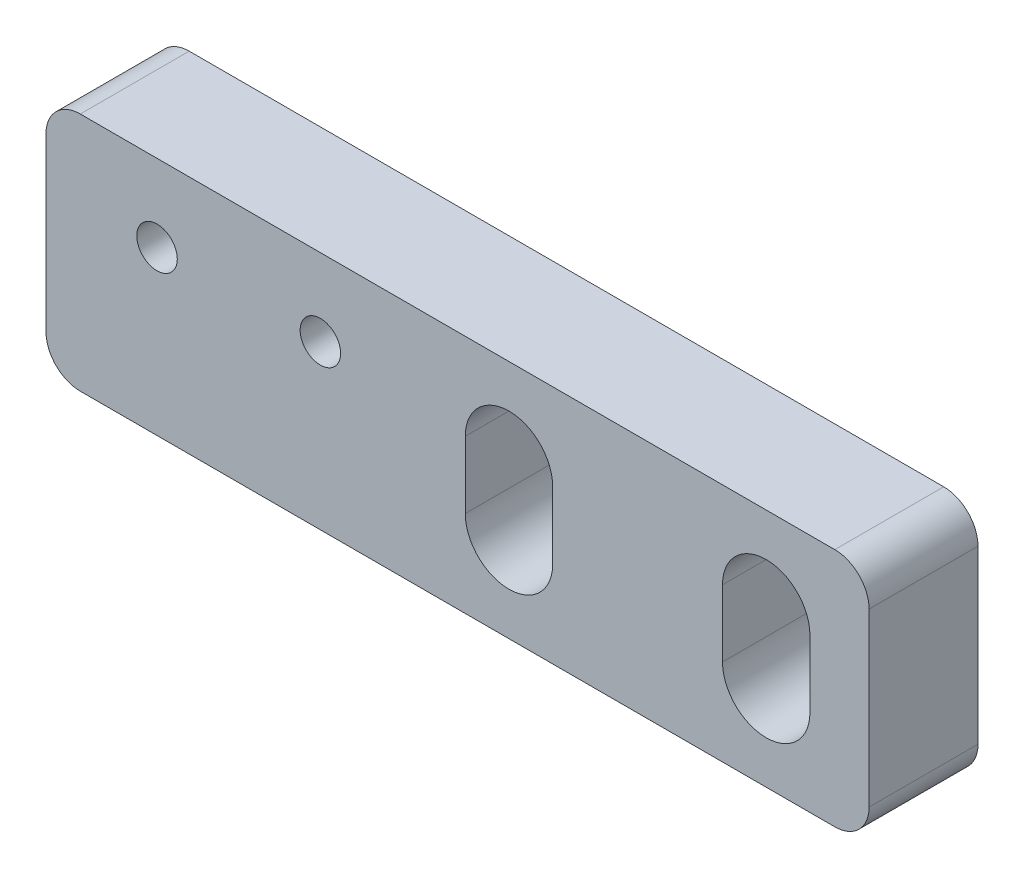
ISO-10303-21;
HEADER;
FILE_DESCRIPTION(('STEP AP214'),'2;1');
FILE_NAME('part.step','',(''),(''),'','','');
FILE_SCHEMA(('AUTOMOTIVE_DESIGN { 1 0 10303 214 1 1 1 1 }'));
ENDSEC;
DATA;
#1=APPLICATION_CONTEXT('core data for automotive mechanical design processes');
#2=APPLICATION_PROTOCOL_DEFINITION('international standard','automotive_design',2000,#1);
#3=PRODUCT_CONTEXT('',#1,'mechanical');
#4=PRODUCT('Part','Part','',(#3));
#5=PRODUCT_RELATED_PRODUCT_CATEGORY('part','',(#4));
#6=PRODUCT_DEFINITION_FORMATION('','',#4);
#7=PRODUCT_DEFINITION_CONTEXT('part definition',#1,'design');
#8=PRODUCT_DEFINITION('design','',#6,#7);
#9=PRODUCT_DEFINITION_SHAPE('','',#8);
#10=(LENGTH_UNIT() NAMED_UNIT(*) SI_UNIT(.MILLI.,.METRE.));
#11=(NAMED_UNIT(*) PLANE_ANGLE_UNIT() SI_UNIT($,.RADIAN.));
#12=(NAMED_UNIT(*) SI_UNIT($,.STERADIAN.) SOLID_ANGLE_UNIT());
#13=UNCERTAINTY_MEASURE_WITH_UNIT(LENGTH_MEASURE(1.E-05),#10,'distance_accuracy_value','');
#14=(GEOMETRIC_REPRESENTATION_CONTEXT(3) GLOBAL_UNCERTAINTY_ASSIGNED_CONTEXT((#13)) GLOBAL_UNIT_ASSIGNED_CONTEXT((#10,
#11,#12)) REPRESENTATION_CONTEXT('',''));
#15=CARTESIAN_POINT('',(0.,0.,0.));
#16=DIRECTION('',(0.,0.,1.));
#17=DIRECTION('',(1.,0.,0.));
#18=AXIS2_PLACEMENT_3D('',#15,#16,#17);
#19=CARTESIAN_POINT('',(421.033701587885,207.351559901808,0.));
#20=DIRECTION('',(0.,0.,1.));
#21=DIRECTION('',(1.,0.,0.));
#22=AXIS2_PLACEMENT_3D('',#19,#20,#21);
#23=PLANE('',#22);
#24=CARTESIAN_POINT('',(403.50870158906,248.88385422266,0.));
#25=DIRECTION('',(0.,0.,1.));
#26=DIRECTION('',(1.,0.,0.));
#27=AXIS2_PLACEMENT_3D('',#24,#25,#26);
#28=CIRCLE('',#27,2.28600000000001);
#29=CARTESIAN_POINT('',(405.79470158906,248.88385422266,0.));
#30=VERTEX_POINT('',#29);
#31=EDGE_CURVE('E356',#30,#30,#28,.T.);
#32=ORIENTED_EDGE('',*,*,#31,.T.);
#33=EDGE_LOOP('',(#32));
#34=FACE_BOUND('',#33,.T.);
#35=CARTESIAN_POINT('',(424.033701588,244.4338542225,0.));
#36=DIRECTION('',(0.,0.,1.));
#37=DIRECTION('',(1.,0.,0.));
#38=AXIS2_PLACEMENT_3D('',#35,#36,#37);
#39=CIRCLE('',#38,2.55000000032002);
#40=CARTESIAN_POINT('',(421.48370158768,244.4338542225,0.));
#41=VERTEX_POINT('',#40);
#42=CARTESIAN_POINT('',(426.58370158832,244.4338542225,0.));
#43=VERTEX_POINT('',#42);
#44=EDGE_CURVE('E188',#41,#43,#39,.T.);
#45=ORIENTED_EDGE('',*,*,#44,.T.);
#46=DIRECTION('',(0.,1.,0.));
#47=VECTOR('',#46,1.);
#48=CARTESIAN_POINT('',(426.58370158832,207.351559901808,0.));
#49=LINE('',#48,#47);
#50=CARTESIAN_POINT('',(426.58370158832,248.33385422284,0.));
#51=VERTEX_POINT('',#50);
#52=EDGE_CURVE('E198',#43,#51,#49,.T.);
#53=ORIENTED_EDGE('',*,*,#52,.T.);
#54=CARTESIAN_POINT('',(424.033701588,248.33385422284,0.));
#55=DIRECTION('',(0.,0.,1.));
#56=DIRECTION('',(1.,0.,0.));
#57=AXIS2_PLACEMENT_3D('',#54,#55,#56);
#58=CIRCLE('',#57,2.55000000032002);
#59=CARTESIAN_POINT('',(421.48370158768,248.33385422284,0.));
#60=VERTEX_POINT('',#59);
#61=EDGE_CURVE('E195',#51,#60,#58,.T.);
#62=ORIENTED_EDGE('',*,*,#61,.T.);
#63=DIRECTION('',(0.,-1.,0.));
#64=VECTOR('',#63,1.);
#65=CARTESIAN_POINT('',(421.48370158768,207.351559901808,0.));
#66=LINE('',#65,#64);
#67=EDGE_CURVE('E191',#60,#41,#66,.T.);
#68=ORIENTED_EDGE('',*,*,#67,.T.);
#69=EDGE_LOOP('',(#45,#53,#62,#68));
#70=FACE_BOUND('',#69,.T.);
#71=CARTESIAN_POINT('',(439.03370158794,244.4338542225,0.));
#72=DIRECTION('',(0.,0.,1.));
#73=DIRECTION('',(1.,0.,0.));
#74=AXIS2_PLACEMENT_3D('',#71,#72,#73);
#75=CIRCLE('',#74,2.55000000032002);
#76=CARTESIAN_POINT('',(436.48370158762,244.4338542225,0.));
#77=VERTEX_POINT('',#76);
#78=CARTESIAN_POINT('',(441.58370158826,244.4338542225,0.));
#79=VERTEX_POINT('',#78);
#80=EDGE_CURVE('E201',#77,#79,#75,.T.);
#81=ORIENTED_EDGE('',*,*,#80,.T.);
#82=DIRECTION('',(0.,1.,0.));
#83=VECTOR('',#82,1.);
#84=CARTESIAN_POINT('',(441.58370158826,207.351559901808,0.));
#85=LINE('',#84,#83);
#86=CARTESIAN_POINT('',(441.58370158826,248.33385422284,0.));
#87=VERTEX_POINT('',#86);
#88=EDGE_CURVE('E210',#79,#87,#85,.T.);
#89=ORIENTED_EDGE('',*,*,#88,.T.);
#90=CARTESIAN_POINT('',(439.03370158794,248.33385422284,0.));
#91=DIRECTION('',(0.,0.,1.));
#92=DIRECTION('',(1.,0.,0.));
#93=AXIS2_PLACEMENT_3D('',#90,#91,#92);
#94=CIRCLE('',#93,2.55000000032002);
#95=CARTESIAN_POINT('',(436.48370158762,248.33385422284,0.));
#96=VERTEX_POINT('',#95);
#97=EDGE_CURVE('E207',#87,#96,#94,.T.);
#98=ORIENTED_EDGE('',*,*,#97,.T.);
#99=DIRECTION('',(0.,-1.,0.));
#100=VECTOR('',#99,1.);
#101=CARTESIAN_POINT('',(436.48370158762,207.351559901808,0.));
#102=LINE('',#101,#100);
#103=EDGE_CURVE('E204',#96,#77,#102,.T.);
#104=ORIENTED_EDGE('',*,*,#103,.T.);
#105=EDGE_LOOP('',(#81,#89,#98,#104));
#106=FACE_BOUND('',#105,.T.);
#107=DIRECTION('',(1.,0.,0.));
#108=VECTOR('',#107,1.);
#109=CARTESIAN_POINT('',(421.033701587885,239.38385422346,0.));
#110=LINE('',#109,#108);
#111=CARTESIAN_POINT('',(399.0337015881,239.38385422346,0.));
#112=VERTEX_POINT('',#111);
#113=CARTESIAN_POINT('',(443.03370158894,239.38385422346,0.));
#114=VERTEX_POINT('',#113);
#115=EDGE_CURVE('E213',#112,#114,#110,.T.);
#116=ORIENTED_EDGE('',*,*,#115,.F.);
#117=CARTESIAN_POINT('',(399.0337015881,241.38385422396,0.));
#118=DIRECTION('',(0.,0.,1.));
#119=DIRECTION('',(1.,0.,0.));
#120=AXIS2_PLACEMENT_3D('',#117,#118,#119);
#121=CIRCLE('',#120,2.00000000049999);
#122=CARTESIAN_POINT('',(397.0337015876,241.38385422396,0.));
#123=VERTEX_POINT('',#122);
#124=EDGE_CURVE('E111',#123,#112,#121,.T.);
#125=ORIENTED_EDGE('',*,*,#124,.F.);
#126=DIRECTION('',(0.,-1.,0.));
#127=VECTOR('',#126,1.);
#128=CARTESIAN_POINT('',(397.0337015876,207.351559901808,0.));
#129=LINE('',#128,#127);
#130=CARTESIAN_POINT('',(397.0337015876,251.38385422392,0.));
#131=VERTEX_POINT('',#130);
#132=EDGE_CURVE('E105',#131,#123,#129,.T.);
#133=ORIENTED_EDGE('',*,*,#132,.F.);
#134=CARTESIAN_POINT('',(399.0337015881,251.38385422392,0.));
#135=DIRECTION('',(0.,0.,1.));
#136=DIRECTION('',(1.,0.,0.));
#137=AXIS2_PLACEMENT_3D('',#134,#135,#136);
#138=CIRCLE('',#137,2.00000000050002);
#139=CARTESIAN_POINT('',(399.0337015881,253.38385422442,0.));
#140=VERTEX_POINT('',#139);
#141=EDGE_CURVE('E172',#140,#131,#138,.T.);
#142=ORIENTED_EDGE('',*,*,#141,.F.);
#143=DIRECTION('',(-1.,0.,0.));
#144=VECTOR('',#143,1.);
#145=CARTESIAN_POINT('',(421.033701587885,253.38385422442,0.));
#146=LINE('',#145,#144);
#147=CARTESIAN_POINT('',(443.03370158894,253.38385422442,0.));
#148=VERTEX_POINT('',#147);
#149=EDGE_CURVE('E222',#148,#140,#146,.T.);
#150=ORIENTED_EDGE('',*,*,#149,.F.);
#151=CARTESIAN_POINT('',(443.03370158894,251.38385422519,0.));
#152=DIRECTION('',(0.,0.,1.));
#153=DIRECTION('',(1.,0.,0.));
#154=AXIS2_PLACEMENT_3D('',#151,#152,#153);
#155=CIRCLE('',#154,1.99999999923003);
#156=CARTESIAN_POINT('',(445.03370158817,251.38385422265,0.));
#157=VERTEX_POINT('',#156);
#158=EDGE_CURVE('E220',#157,#148,#155,.T.);
#159=ORIENTED_EDGE('',*,*,#158,.F.);
#160=DIRECTION('',(0.,1.,0.));
#161=VECTOR('',#160,1.);
#162=CARTESIAN_POINT('',(445.03370158817,207.351559901808,0.));
#163=LINE('',#162,#161);
#164=CARTESIAN_POINT('',(445.03370158817,241.38385422269,0.));
#165=VERTEX_POINT('',#164);
#166=EDGE_CURVE('E218',#165,#157,#163,.T.);
#167=ORIENTED_EDGE('',*,*,#166,.F.);
#168=CARTESIAN_POINT('',(443.03370158894,241.38385422269,0.));
#169=DIRECTION('',(0.,0.,1.));
#170=DIRECTION('',(1.,0.,0.));
#171=AXIS2_PLACEMENT_3D('',#168,#169,#170);
#172=CIRCLE('',#171,1.99999999923001);
#173=EDGE_CURVE('E216',#114,#165,#172,.T.);
#174=ORIENTED_EDGE('',*,*,#173,.F.);
#175=EDGE_LOOP('',(#116,#125,#133,#142,#150,#159,#167,#174));
#176=FACE_BOUND('',#175,.T.);
#177=CARTESIAN_POINT('',(413.03370158906,248.88385422266,0.));
#178=DIRECTION('',(0.,0.,1.));
#179=DIRECTION('',(1.,0.,0.));
#180=AXIS2_PLACEMENT_3D('',#177,#178,#179);
#181=CIRCLE('',#180,2.28600000000001);
#182=CARTESIAN_POINT('',(415.31970158906,248.88385422266,0.));
#183=VERTEX_POINT('',#182);
#184=EDGE_CURVE('E363',#183,#183,#181,.T.);
#185=ORIENTED_EDGE('',*,*,#184,.T.);
#186=EDGE_LOOP('',(#185));
#187=FACE_BOUND('',#186,.T.);
#188=ADVANCED_FACE('F33',(#34,#70,#106,#176,#187),#23,.F.);
#189=CARTESIAN_POINT('',(421.033701587885,239.38385422346,6.35));
#190=DIRECTION('',(0.,1.,0.));
#191=DIRECTION('',(0.,0.,1.));
#192=AXIS2_PLACEMENT_3D('',#189,#190,#191);
#193=PLANE('',#192);
#194=ORIENTED_EDGE('',*,*,#115,.T.);
#195=DIRECTION('',(0.,0.,-1.));
#196=VECTOR('',#195,1.);
#197=CARTESIAN_POINT('',(443.03370158894,239.38385422346,6.35));
#198=LINE('',#197,#196);
#199=CARTESIAN_POINT('',(443.03370158894,239.38385422346,6.35));
#200=VERTEX_POINT('',#199);
#201=EDGE_CURVE('E11',#200,#114,#198,.T.);
#202=ORIENTED_EDGE('',*,*,#201,.F.);
#203=DIRECTION('',(1.,0.,0.));
#204=VECTOR('',#203,1.);
#205=CARTESIAN_POINT('',(421.033701587885,239.38385422346,6.35));
#206=LINE('',#205,#204);
#207=CARTESIAN_POINT('',(399.0337015881,239.38385422346,6.35));
#208=VERTEX_POINT('',#207);
#209=EDGE_CURVE('E289',#208,#200,#206,.T.);
#210=ORIENTED_EDGE('',*,*,#209,.F.);
#211=DIRECTION('',(0.,0.,-1.));
#212=VECTOR('',#211,1.);
#213=CARTESIAN_POINT('',(399.0337015881,239.38385422346,6.35));
#214=LINE('',#213,#212);
#215=EDGE_CURVE('E228',#208,#112,#214,.T.);
#216=ORIENTED_EDGE('',*,*,#215,.T.);
#217=EDGE_LOOP('',(#194,#202,#210,#216));
#218=FACE_BOUND('',#217,.T.);
#219=ADVANCED_FACE('F312',(#218),#193,.F.);
#220=CARTESIAN_POINT('',(443.03370158894,241.38385422269,6.35));
#221=DIRECTION('',(0.,0.,-1.));
#222=DIRECTION('',(-1.,0.,0.));
#223=AXIS2_PLACEMENT_3D('',#220,#221,#222);
#224=CYLINDRICAL_SURFACE('',#223,1.99999999923001);
#225=ORIENTED_EDGE('',*,*,#173,.T.);
#226=DIRECTION('',(0.,0.,-1.));
#227=VECTOR('',#226,1.);
#228=CARTESIAN_POINT('',(445.03370158817,241.38385422269,6.35));
#229=LINE('',#228,#227);
#230=CARTESIAN_POINT('',(445.03370158817,241.38385422269,6.35));
#231=VERTEX_POINT('',#230);
#232=EDGE_CURVE('E43',#231,#165,#229,.T.);
#233=ORIENTED_EDGE('',*,*,#232,.F.);
#234=CARTESIAN_POINT('',(443.03370158894,241.38385422269,6.35));
#235=DIRECTION('',(0.,0.,1.));
#236=DIRECTION('',(1.,0.,0.));
#237=AXIS2_PLACEMENT_3D('',#234,#235,#236);
#238=CIRCLE('',#237,1.99999999923001);
#239=EDGE_CURVE('E291',#200,#231,#238,.T.);
#240=ORIENTED_EDGE('',*,*,#239,.F.);
#241=ORIENTED_EDGE('',*,*,#201,.T.);
#242=EDGE_LOOP('',(#225,#233,#240,#241));
#243=FACE_BOUND('',#242,.T.);
#244=ADVANCED_FACE('F334',(#243),#224,.T.);
#245=CARTESIAN_POINT('',(445.03370158817,207.351559901808,6.35));
#246=DIRECTION('',(-1.,0.,0.));
#247=DIRECTION('',(0.,0.,1.));
#248=AXIS2_PLACEMENT_3D('',#245,#246,#247);
#249=PLANE('',#248);
#250=ORIENTED_EDGE('',*,*,#166,.T.);
#251=DIRECTION('',(0.,0.,-1.));
#252=VECTOR('',#251,1.);
#253=CARTESIAN_POINT('',(445.03370158817,251.38385422265,6.35));
#254=LINE('',#253,#252);
#255=CARTESIAN_POINT('',(445.03370158817,251.38385422265,6.35));
#256=VERTEX_POINT('',#255);
#257=EDGE_CURVE('E236',#256,#157,#254,.T.);
#258=ORIENTED_EDGE('',*,*,#257,.F.);
#259=DIRECTION('',(0.,1.,0.));
#260=VECTOR('',#259,1.);
#261=CARTESIAN_POINT('',(445.03370158817,207.351559901808,6.35));
#262=LINE('',#261,#260);
#263=EDGE_CURVE('E293',#231,#256,#262,.T.);
#264=ORIENTED_EDGE('',*,*,#263,.F.);
#265=ORIENTED_EDGE('',*,*,#232,.T.);
#266=EDGE_LOOP('',(#250,#258,#264,#265));
#267=FACE_BOUND('',#266,.T.);
#268=ADVANCED_FACE('F545',(#267),#249,.F.);
#269=CARTESIAN_POINT('',(443.03370158894,251.38385422519,6.35));
#270=DIRECTION('',(0.,0.,-1.));
#271=DIRECTION('',(-1.,0.,0.));
#272=AXIS2_PLACEMENT_3D('',#269,#270,#271);
#273=CYLINDRICAL_SURFACE('',#272,1.99999999923003);
#274=ORIENTED_EDGE('',*,*,#158,.T.);
#275=DIRECTION('',(0.,0.,-1.));
#276=VECTOR('',#275,1.);
#277=CARTESIAN_POINT('',(443.03370158894,253.38385422442,6.35));
#278=LINE('',#277,#276);
#279=CARTESIAN_POINT('',(443.03370158894,253.38385422442,6.35));
#280=VERTEX_POINT('',#279);
#281=EDGE_CURVE('E233',#280,#148,#278,.T.);
#282=ORIENTED_EDGE('',*,*,#281,.F.);
#283=CARTESIAN_POINT('',(443.03370158894,251.38385422519,6.35));
#284=DIRECTION('',(0.,0.,1.));
#285=DIRECTION('',(1.,0.,0.));
#286=AXIS2_PLACEMENT_3D('',#283,#284,#285);
#287=CIRCLE('',#286,1.99999999923003);
#288=EDGE_CURVE('E295',#256,#280,#287,.T.);
#289=ORIENTED_EDGE('',*,*,#288,.F.);
#290=ORIENTED_EDGE('',*,*,#257,.T.);
#291=EDGE_LOOP('',(#274,#282,#289,#290));
#292=FACE_BOUND('',#291,.T.);
#293=ADVANCED_FACE('F301',(#292),#273,.T.);
#294=CARTESIAN_POINT('',(421.033701587885,253.38385422442,6.35));
#295=DIRECTION('',(0.,-1.,0.));
#296=DIRECTION('',(0.,0.,-1.));
#297=AXIS2_PLACEMENT_3D('',#294,#295,#296);
#298=PLANE('',#297);
#299=ORIENTED_EDGE('',*,*,#149,.T.);
#300=DIRECTION('',(0.,0.,-1.));
#301=VECTOR('',#300,1.);
#302=CARTESIAN_POINT('',(399.0337015881,253.38385422442,6.35));
#303=LINE('',#302,#301);
#304=CARTESIAN_POINT('',(399.0337015881,253.38385422442,6.35));
#305=VERTEX_POINT('',#304);
#306=EDGE_CURVE('E173',#305,#140,#303,.T.);
#307=ORIENTED_EDGE('',*,*,#306,.F.);
#308=DIRECTION('',(-1.,0.,0.));
#309=VECTOR('',#308,1.);
#310=CARTESIAN_POINT('',(421.033701587885,253.38385422442,6.35));
#311=LINE('',#310,#309);
#312=EDGE_CURVE('E164',#280,#305,#311,.T.);
#313=ORIENTED_EDGE('',*,*,#312,.F.);
#314=ORIENTED_EDGE('',*,*,#281,.T.);
#315=EDGE_LOOP('',(#299,#307,#313,#314));
#316=FACE_BOUND('',#315,.T.);
#317=ADVANCED_FACE('F305',(#316),#298,.F.);
#318=CARTESIAN_POINT('',(399.0337015881,251.38385422392,6.35));
#319=DIRECTION('',(0.,0.,-1.));
#320=DIRECTION('',(-1.,0.,0.));
#321=AXIS2_PLACEMENT_3D('',#318,#319,#320);
#322=CYLINDRICAL_SURFACE('',#321,2.00000000050002);
#323=ORIENTED_EDGE('',*,*,#141,.T.);
#324=DIRECTION('',(0.,0.,-1.));
#325=VECTOR('',#324,1.);
#326=CARTESIAN_POINT('',(397.0337015876,251.38385422392,6.35));
#327=LINE('',#326,#325);
#328=CARTESIAN_POINT('',(397.0337015876,251.38385422392,6.35));
#329=VERTEX_POINT('',#328);
#330=EDGE_CURVE('E169',#329,#131,#327,.T.);
#331=ORIENTED_EDGE('',*,*,#330,.F.);
#332=CARTESIAN_POINT('',(399.0337015881,251.38385422392,6.35));
#333=DIRECTION('',(0.,0.,1.));
#334=DIRECTION('',(1.,0.,0.));
#335=AXIS2_PLACEMENT_3D('',#332,#333,#334);
#336=CIRCLE('',#335,2.00000000050002);
#337=EDGE_CURVE('E157',#305,#329,#336,.T.);
#338=ORIENTED_EDGE('',*,*,#337,.F.);
#339=ORIENTED_EDGE('',*,*,#306,.T.);
#340=EDGE_LOOP('',(#323,#331,#338,#339));
#341=FACE_BOUND('',#340,.T.);
#342=ADVANCED_FACE('F170',(#341),#322,.T.);
#343=CARTESIAN_POINT('',(397.0337015876,207.351559901808,6.35));
#344=DIRECTION('',(1.,0.,0.));
#345=DIRECTION('',(0.,0.,-1.));
#346=AXIS2_PLACEMENT_3D('',#343,#344,#345);
#347=PLANE('',#346);
#348=ORIENTED_EDGE('',*,*,#132,.T.);
#349=DIRECTION('',(0.,0.,-1.));
#350=VECTOR('',#349,1.);
#351=CARTESIAN_POINT('',(397.0337015876,241.38385422396,6.35));
#352=LINE('',#351,#350);
#353=CARTESIAN_POINT('',(397.0337015876,241.38385422396,6.35));
#354=VERTEX_POINT('',#353);
#355=EDGE_CURVE('E174',#354,#123,#352,.T.);
#356=ORIENTED_EDGE('',*,*,#355,.F.);
#357=DIRECTION('',(0.,-1.,0.));
#358=VECTOR('',#357,1.);
#359=CARTESIAN_POINT('',(397.0337015876,207.351559901808,6.35));
#360=LINE('',#359,#358);
#361=EDGE_CURVE('E162',#329,#354,#360,.T.);
#362=ORIENTED_EDGE('',*,*,#361,.F.);
#363=ORIENTED_EDGE('',*,*,#330,.T.);
#364=EDGE_LOOP('',(#348,#356,#362,#363));
#365=FACE_BOUND('',#364,.T.);
#366=ADVANCED_FACE('F176',(#365),#347,.F.);
#367=CARTESIAN_POINT('',(439.03370158794,244.4338542225,6.35));
#368=DIRECTION('',(0.,0.,-1.));
#369=DIRECTION('',(-1.,0.,0.));
#370=AXIS2_PLACEMENT_3D('',#367,#368,#369);
#371=CYLINDRICAL_SURFACE('',#370,2.55000000032002);
#372=ORIENTED_EDGE('',*,*,#80,.F.);
#373=DIRECTION('',(0.,0.,-1.));
#374=VECTOR('',#373,1.);
#375=CARTESIAN_POINT('',(436.48370158762,244.4338542225,6.35));
#376=LINE('',#375,#374);
#377=CARTESIAN_POINT('',(436.48370158762,244.4338542225,6.35));
#378=VERTEX_POINT('',#377);
#379=EDGE_CURVE('E230',#378,#77,#376,.T.);
#380=ORIENTED_EDGE('',*,*,#379,.F.);
#381=CARTESIAN_POINT('',(439.03370158794,244.4338542225,6.35));
#382=DIRECTION('',(0.,0.,1.));
#383=DIRECTION('',(1.,0.,0.));
#384=AXIS2_PLACEMENT_3D('',#381,#382,#383);
#385=CIRCLE('',#384,2.55000000032002);
#386=CARTESIAN_POINT('',(441.58370158826,244.4338542225,6.35));
#387=VERTEX_POINT('',#386);
#388=EDGE_CURVE('E274',#378,#387,#385,.T.);
#389=ORIENTED_EDGE('',*,*,#388,.T.);
#390=DIRECTION('',(0.,0.,-1.));
#391=VECTOR('',#390,1.);
#392=CARTESIAN_POINT('',(441.58370158826,244.4338542225,6.35));
#393=LINE('',#392,#391);
#394=EDGE_CURVE('E241',#387,#79,#393,.T.);
#395=ORIENTED_EDGE('',*,*,#394,.T.);
#396=EDGE_LOOP('',(#372,#380,#389,#395));
#397=FACE_BOUND('',#396,.T.);
#398=ADVANCED_FACE('F503',(#397),#371,.F.);
#399=CARTESIAN_POINT('',(436.48370158762,207.351559901808,6.35));
#400=DIRECTION('',(1.,0.,0.));
#401=DIRECTION('',(0.,0.,-1.));
#402=AXIS2_PLACEMENT_3D('',#399,#400,#401);
#403=PLANE('',#402);
#404=ORIENTED_EDGE('',*,*,#103,.F.);
#405=DIRECTION('',(0.,0.,-1.));
#406=VECTOR('',#405,1.);
#407=CARTESIAN_POINT('',(436.48370158762,248.33385422284,6.35));
#408=LINE('',#407,#406);
#409=CARTESIAN_POINT('',(436.48370158762,248.33385422284,6.35));
#410=VERTEX_POINT('',#409);
#411=EDGE_CURVE('E245',#410,#96,#408,.T.);
#412=ORIENTED_EDGE('',*,*,#411,.F.);
#413=DIRECTION('',(0.,-1.,0.));
#414=VECTOR('',#413,1.);
#415=CARTESIAN_POINT('',(436.48370158762,207.351559901808,6.35));
#416=LINE('',#415,#414);
#417=EDGE_CURVE('E277',#410,#378,#416,.T.);
#418=ORIENTED_EDGE('',*,*,#417,.T.);
#419=ORIENTED_EDGE('',*,*,#379,.T.);
#420=EDGE_LOOP('',(#404,#412,#418,#419));
#421=FACE_BOUND('',#420,.T.);
#422=ADVANCED_FACE('F493',(#421),#403,.T.);
#423=CARTESIAN_POINT('',(439.03370158794,248.33385422284,6.35));
#424=DIRECTION('',(0.,0.,-1.));
#425=DIRECTION('',(-1.,0.,0.));
#426=AXIS2_PLACEMENT_3D('',#423,#424,#425);
#427=CYLINDRICAL_SURFACE('',#426,2.55000000032002);
#428=ORIENTED_EDGE('',*,*,#97,.F.);
#429=DIRECTION('',(0.,0.,-1.));
#430=VECTOR('',#429,1.);
#431=CARTESIAN_POINT('',(441.58370158826,248.33385422284,6.35));
#432=LINE('',#431,#430);
#433=CARTESIAN_POINT('',(441.58370158826,248.33385422284,6.35));
#434=VERTEX_POINT('',#433);
#435=EDGE_CURVE('E243',#434,#87,#432,.T.);
#436=ORIENTED_EDGE('',*,*,#435,.F.);
#437=CARTESIAN_POINT('',(439.03370158794,248.33385422284,6.35));
#438=DIRECTION('',(0.,0.,1.));
#439=DIRECTION('',(1.,0.,0.));
#440=AXIS2_PLACEMENT_3D('',#437,#438,#439);
#441=CIRCLE('',#440,2.55000000032002);
#442=EDGE_CURVE('E283',#434,#410,#441,.T.);
#443=ORIENTED_EDGE('',*,*,#442,.T.);
#444=ORIENTED_EDGE('',*,*,#411,.T.);
#445=EDGE_LOOP('',(#428,#436,#443,#444));
#446=FACE_BOUND('',#445,.T.);
#447=ADVANCED_FACE('F485',(#446),#427,.F.);
#448=CARTESIAN_POINT('',(424.033701588,244.4338542225,6.35));
#449=DIRECTION('',(0.,0.,-1.));
#450=DIRECTION('',(-1.,0.,0.));
#451=AXIS2_PLACEMENT_3D('',#448,#449,#450);
#452=CYLINDRICAL_SURFACE('',#451,2.55000000032002);
#453=ORIENTED_EDGE('',*,*,#44,.F.);
#454=DIRECTION('',(0.,0.,-1.));
#455=VECTOR('',#454,1.);
#456=CARTESIAN_POINT('',(421.48370158768,244.4338542225,6.35));
#457=LINE('',#456,#455);
#458=CARTESIAN_POINT('',(421.48370158768,244.4338542225,6.35));
#459=VERTEX_POINT('',#458);
#460=EDGE_CURVE('E37',#459,#41,#457,.T.);
#461=ORIENTED_EDGE('',*,*,#460,.F.);
#462=CARTESIAN_POINT('',(424.033701588,244.4338542225,6.35));
#463=DIRECTION('',(0.,0.,1.));
#464=DIRECTION('',(1.,0.,0.));
#465=AXIS2_PLACEMENT_3D('',#462,#463,#464);
#466=CIRCLE('',#465,2.55000000032002);
#467=CARTESIAN_POINT('',(426.58370158832,244.4338542225,6.35));
#468=VERTEX_POINT('',#467);
#469=EDGE_CURVE('E227',#459,#468,#466,.T.);
#470=ORIENTED_EDGE('',*,*,#469,.T.);
#471=DIRECTION('',(0.,0.,-1.));
#472=VECTOR('',#471,1.);
#473=CARTESIAN_POINT('',(426.58370158832,244.4338542225,6.35));
#474=LINE('',#473,#472);
#475=EDGE_CURVE('E187',#468,#43,#474,.T.);
#476=ORIENTED_EDGE('',*,*,#475,.T.);
#477=EDGE_LOOP('',(#453,#461,#470,#476));
#478=FACE_BOUND('',#477,.T.);
#479=ADVANCED_FACE('F35',(#478),#452,.F.);
#480=CARTESIAN_POINT('',(421.48370158768,207.351559901808,6.35));
#481=DIRECTION('',(1.,0.,0.));
#482=DIRECTION('',(0.,0.,-1.));
#483=AXIS2_PLACEMENT_3D('',#480,#481,#482);
#484=PLANE('',#483);
#485=ORIENTED_EDGE('',*,*,#67,.F.);
#486=DIRECTION('',(0.,0.,-1.));
#487=VECTOR('',#486,1.);
#488=CARTESIAN_POINT('',(421.48370158768,248.33385422284,6.35));
#489=LINE('',#488,#487);
#490=CARTESIAN_POINT('',(421.48370158768,248.33385422284,6.35));
#491=VERTEX_POINT('',#490);
#492=EDGE_CURVE('E250',#491,#60,#489,.T.);
#493=ORIENTED_EDGE('',*,*,#492,.F.);
#494=DIRECTION('',(0.,-1.,0.));
#495=VECTOR('',#494,1.);
#496=CARTESIAN_POINT('',(421.48370158768,207.351559901808,6.35));
#497=LINE('',#496,#495);
#498=EDGE_CURVE('E259',#491,#459,#497,.T.);
#499=ORIENTED_EDGE('',*,*,#498,.T.);
#500=ORIENTED_EDGE('',*,*,#460,.T.);
#501=EDGE_LOOP('',(#485,#493,#499,#500));
#502=FACE_BOUND('',#501,.T.);
#503=ADVANCED_FACE('F257',(#502),#484,.T.);
#504=CARTESIAN_POINT('',(424.033701588,248.33385422284,6.35));
#505=DIRECTION('',(0.,0.,-1.));
#506=DIRECTION('',(-1.,0.,0.));
#507=AXIS2_PLACEMENT_3D('',#504,#505,#506);
#508=CYLINDRICAL_SURFACE('',#507,2.55000000032002);
#509=ORIENTED_EDGE('',*,*,#61,.F.);
#510=DIRECTION('',(0.,0.,-1.));
#511=VECTOR('',#510,1.);
#512=CARTESIAN_POINT('',(426.58370158832,248.33385422284,6.35));
#513=LINE('',#512,#511);
#514=CARTESIAN_POINT('',(426.58370158832,248.33385422284,6.35));
#515=VERTEX_POINT('',#514);
#516=EDGE_CURVE('E249',#515,#51,#513,.T.);
#517=ORIENTED_EDGE('',*,*,#516,.F.);
#518=CARTESIAN_POINT('',(424.033701588,248.33385422284,6.35));
#519=DIRECTION('',(0.,0.,1.));
#520=DIRECTION('',(1.,0.,0.));
#521=AXIS2_PLACEMENT_3D('',#518,#519,#520);
#522=CIRCLE('',#521,2.55000000032002);
#523=EDGE_CURVE('E265',#515,#491,#522,.T.);
#524=ORIENTED_EDGE('',*,*,#523,.T.);
#525=ORIENTED_EDGE('',*,*,#492,.T.);
#526=EDGE_LOOP('',(#509,#517,#524,#525));
#527=FACE_BOUND('',#526,.T.);
#528=ADVANCED_FACE('F263',(#527),#508,.F.);
#529=CARTESIAN_POINT('',(413.03370158906,248.88385422266,6.35));
#530=DIRECTION('',(0.,0.,-1.));
#531=DIRECTION('',(-1.,0.,0.));
#532=AXIS2_PLACEMENT_3D('',#529,#530,#531);
#533=CYLINDRICAL_SURFACE('',#532,1.18100000019999);
#534=CARTESIAN_POINT('',(413.03370158906,248.88385422266,3.175));
#535=DIRECTION('',(0.,0.,1.));
#536=DIRECTION('',(1.,0.,0.));
#537=AXIS2_PLACEMENT_3D('',#534,#535,#536);
#538=CIRCLE('',#537,1.18100000019999);
#539=CARTESIAN_POINT('',(414.21470158926,248.88385422266,3.175));
#540=VERTEX_POINT('',#539);
#541=EDGE_CURVE('E367',#540,#540,#538,.T.);
#542=ORIENTED_EDGE('',*,*,#541,.F.);
#543=EDGE_LOOP('',(#542));
#544=FACE_BOUND('',#543,.T.);
#545=CARTESIAN_POINT('',(413.03370158906,248.88385422266,6.35));
#546=DIRECTION('',(0.,0.,1.));
#547=DIRECTION('',(1.,0.,0.));
#548=AXIS2_PLACEMENT_3D('',#545,#546,#547);
#549=CIRCLE('',#548,1.18100000019999);
#550=CARTESIAN_POINT('',(414.21470158926,248.88385422266,6.35));
#551=VERTEX_POINT('',#550);
#552=EDGE_CURVE('E178',#551,#551,#549,.T.);
#553=ORIENTED_EDGE('',*,*,#552,.T.);
#554=EDGE_LOOP('',(#553));
#555=FACE_BOUND('',#554,.T.);
#556=ADVANCED_FACE('F317',(#544,#555),#533,.F.);
#557=CARTESIAN_POINT('',(399.0337015881,241.38385422396,6.35));
#558=DIRECTION('',(0.,0.,-1.));
#559=DIRECTION('',(-1.,0.,0.));
#560=AXIS2_PLACEMENT_3D('',#557,#558,#559);
#561=CYLINDRICAL_SURFACE('',#560,2.00000000049999);
#562=ORIENTED_EDGE('',*,*,#124,.T.);
#563=ORIENTED_EDGE('',*,*,#215,.F.);
#564=CARTESIAN_POINT('',(399.0337015881,241.38385422396,6.35));
#565=DIRECTION('',(0.,0.,1.));
#566=DIRECTION('',(1.,0.,0.));
#567=AXIS2_PLACEMENT_3D('',#564,#565,#566);
#568=CIRCLE('',#567,2.00000000049999);
#569=EDGE_CURVE('E52',#354,#208,#568,.T.);
#570=ORIENTED_EDGE('',*,*,#569,.F.);
#571=ORIENTED_EDGE('',*,*,#355,.T.);
#572=EDGE_LOOP('',(#562,#563,#570,#571));
#573=FACE_BOUND('',#572,.T.);
#574=ADVANCED_FACE('F314',(#573),#561,.T.);
#575=CARTESIAN_POINT('',(441.58370158826,207.351559901808,6.35));
#576=DIRECTION('',(-1.,0.,0.));
#577=DIRECTION('',(0.,0.,1.));
#578=AXIS2_PLACEMENT_3D('',#575,#576,#577);
#579=PLANE('',#578);
#580=ORIENTED_EDGE('',*,*,#88,.F.);
#581=ORIENTED_EDGE('',*,*,#394,.F.);
#582=DIRECTION('',(0.,1.,0.));
#583=VECTOR('',#582,1.);
#584=CARTESIAN_POINT('',(441.58370158826,207.351559901808,6.35));
#585=LINE('',#584,#583);
#586=EDGE_CURVE('E286',#387,#434,#585,.T.);
#587=ORIENTED_EDGE('',*,*,#586,.T.);
#588=ORIENTED_EDGE('',*,*,#435,.T.);
#589=EDGE_LOOP('',(#580,#581,#587,#588));
#590=FACE_BOUND('',#589,.T.);
#591=ADVANCED_FACE('F316',(#590),#579,.T.);
#592=CARTESIAN_POINT('',(426.58370158832,207.351559901808,6.35));
#593=DIRECTION('',(-1.,0.,0.));
#594=DIRECTION('',(0.,0.,1.));
#595=AXIS2_PLACEMENT_3D('',#592,#593,#594);
#596=PLANE('',#595);
#597=ORIENTED_EDGE('',*,*,#52,.F.);
#598=ORIENTED_EDGE('',*,*,#475,.F.);
#599=DIRECTION('',(0.,1.,0.));
#600=VECTOR('',#599,1.);
#601=CARTESIAN_POINT('',(426.58370158832,207.351559901808,6.35));
#602=LINE('',#601,#600);
#603=EDGE_CURVE('E271',#468,#515,#602,.T.);
#604=ORIENTED_EDGE('',*,*,#603,.T.);
#605=ORIENTED_EDGE('',*,*,#516,.T.);
#606=EDGE_LOOP('',(#597,#598,#604,#605));
#607=FACE_BOUND('',#606,.T.);
#608=ADVANCED_FACE('F273',(#607),#596,.T.);
#609=CARTESIAN_POINT('',(403.50870158906,248.88385422266,6.35));
#610=DIRECTION('',(0.,0.,-1.));
#611=DIRECTION('',(-1.,0.,0.));
#612=AXIS2_PLACEMENT_3D('',#609,#610,#611);
#613=CYLINDRICAL_SURFACE('',#612,1.18100000019999);
#614=CARTESIAN_POINT('',(403.50870158906,248.88385422266,3.175));
#615=DIRECTION('',(0.,0.,1.));
#616=DIRECTION('',(1.,0.,0.));
#617=AXIS2_PLACEMENT_3D('',#614,#615,#616);
#618=CIRCLE('',#617,1.18100000019999);
#619=CARTESIAN_POINT('',(404.68970158926,248.88385422266,3.175));
#620=VERTEX_POINT('',#619);
#621=EDGE_CURVE('E352',#620,#620,#618,.T.);
#622=ORIENTED_EDGE('',*,*,#621,.F.);
#623=EDGE_LOOP('',(#622));
#624=FACE_BOUND('',#623,.T.);
#625=CARTESIAN_POINT('',(403.50870158906,248.88385422266,6.35));
#626=DIRECTION('',(0.,0.,1.));
#627=DIRECTION('',(1.,0.,0.));
#628=AXIS2_PLACEMENT_3D('',#625,#626,#627);
#629=CIRCLE('',#628,1.18100000019999);
#630=CARTESIAN_POINT('',(404.68970158926,248.88385422266,6.35));
#631=VERTEX_POINT('',#630);
#632=EDGE_CURVE('E184',#631,#631,#629,.T.);
#633=ORIENTED_EDGE('',*,*,#632,.T.);
#634=EDGE_LOOP('',(#633));
#635=FACE_BOUND('',#634,.T.);
#636=ADVANCED_FACE('F340',(#624,#635),#613,.F.);
#637=CARTESIAN_POINT('',(421.033701587885,207.351559901808,6.35));
#638=DIRECTION('',(0.,0.,1.));
#639=DIRECTION('',(1.,0.,0.));
#640=AXIS2_PLACEMENT_3D('',#637,#638,#639);
#641=PLANE('',#640);
#642=ORIENTED_EDGE('',*,*,#469,.F.);
#643=ORIENTED_EDGE('',*,*,#498,.F.);
#644=ORIENTED_EDGE('',*,*,#523,.F.);
#645=ORIENTED_EDGE('',*,*,#603,.F.);
#646=EDGE_LOOP('',(#642,#643,#644,#645));
#647=FACE_BOUND('',#646,.T.);
#648=ORIENTED_EDGE('',*,*,#388,.F.);
#649=ORIENTED_EDGE('',*,*,#417,.F.);
#650=ORIENTED_EDGE('',*,*,#442,.F.);
#651=ORIENTED_EDGE('',*,*,#586,.F.);
#652=EDGE_LOOP('',(#648,#649,#650,#651));
#653=FACE_BOUND('',#652,.T.);
#654=ORIENTED_EDGE('',*,*,#209,.T.);
#655=ORIENTED_EDGE('',*,*,#239,.T.);
#656=ORIENTED_EDGE('',*,*,#263,.T.);
#657=ORIENTED_EDGE('',*,*,#288,.T.);
#658=ORIENTED_EDGE('',*,*,#312,.T.);
#659=ORIENTED_EDGE('',*,*,#337,.T.);
#660=ORIENTED_EDGE('',*,*,#361,.T.);
#661=ORIENTED_EDGE('',*,*,#569,.T.);
#662=EDGE_LOOP('',(#654,#655,#656,#657,#658,#659,#660,#661));
#663=FACE_BOUND('',#662,.T.);
#664=ORIENTED_EDGE('',*,*,#552,.F.);
#665=EDGE_LOOP('',(#664));
#666=FACE_BOUND('',#665,.T.);
#667=ORIENTED_EDGE('',*,*,#632,.F.);
#668=EDGE_LOOP('',(#667));
#669=FACE_BOUND('',#668,.T.);
#670=ADVANCED_FACE('F159',(#647,#653,#663,#666,#669),#641,.T.);
#671=CARTESIAN_POINT('',(403.50870158906,248.88385422266,3.175));
#672=DIRECTION('',(0.,0.,-1.));
#673=DIRECTION('',(-1.,0.,0.));
#674=AXIS2_PLACEMENT_3D('',#671,#672,#673);
#675=CYLINDRICAL_SURFACE('',#674,2.28600000000001);
#676=CARTESIAN_POINT('',(403.50870158906,248.88385422266,3.175));
#677=DIRECTION('',(0.,0.,1.));
#678=DIRECTION('',(1.,0.,0.));
#679=AXIS2_PLACEMENT_3D('',#676,#677,#678);
#680=CIRCLE('',#679,2.28600000000001);
#681=CARTESIAN_POINT('',(405.79470158906,248.88385422266,3.175));
#682=VERTEX_POINT('',#681);
#683=EDGE_CURVE('E192',#682,#682,#680,.T.);
#684=ORIENTED_EDGE('',*,*,#683,.T.);
#685=EDGE_LOOP('',(#684));
#686=FACE_BOUND('',#685,.T.);
#687=ORIENTED_EDGE('',*,*,#31,.F.);
#688=EDGE_LOOP('',(#687));
#689=FACE_BOUND('',#688,.T.);
#690=ADVANCED_FACE('F347',(#686,#689),#675,.F.);
#691=CARTESIAN_POINT('',(421.033701587885,207.351559901808,3.175));
#692=DIRECTION('',(0.,0.,1.));
#693=DIRECTION('',(1.,0.,0.));
#694=AXIS2_PLACEMENT_3D('',#691,#692,#693);
#695=PLANE('',#694);
#696=ORIENTED_EDGE('',*,*,#621,.T.);
#697=EDGE_LOOP('',(#696));
#698=FACE_BOUND('',#697,.T.);
#699=ORIENTED_EDGE('',*,*,#683,.F.);
#700=EDGE_LOOP('',(#699));
#701=FACE_BOUND('',#700,.T.);
#702=ADVANCED_FACE('F384',(#698,#701),#695,.F.);
#703=CARTESIAN_POINT('',(413.03370158906,248.88385422266,3.175));
#704=DIRECTION('',(0.,0.,-1.));
#705=DIRECTION('',(-1.,0.,0.));
#706=AXIS2_PLACEMENT_3D('',#703,#704,#705);
#707=CYLINDRICAL_SURFACE('',#706,2.28600000000001);
#708=CARTESIAN_POINT('',(413.03370158906,248.88385422266,3.175));
#709=DIRECTION('',(0.,0.,1.));
#710=DIRECTION('',(1.,0.,0.));
#711=AXIS2_PLACEMENT_3D('',#708,#709,#710);
#712=CIRCLE('',#711,2.28600000000001);
#713=CARTESIAN_POINT('',(415.31970158906,248.88385422266,3.175));
#714=VERTEX_POINT('',#713);
#715=EDGE_CURVE('E360',#714,#714,#712,.T.);
#716=ORIENTED_EDGE('',*,*,#715,.T.);
#717=EDGE_LOOP('',(#716));
#718=FACE_BOUND('',#717,.T.);
#719=ORIENTED_EDGE('',*,*,#184,.F.);
#720=EDGE_LOOP('',(#719));
#721=FACE_BOUND('',#720,.T.);
#722=ADVANCED_FACE('F378',(#718,#721),#707,.F.);
#723=CARTESIAN_POINT('',(421.033701587885,207.351559901808,3.175));
#724=DIRECTION('',(0.,0.,1.));
#725=DIRECTION('',(1.,0.,0.));
#726=AXIS2_PLACEMENT_3D('',#723,#724,#725);
#727=PLANE('',#726);
#728=ORIENTED_EDGE('',*,*,#541,.T.);
#729=EDGE_LOOP('',(#728));
#730=FACE_BOUND('',#729,.T.);
#731=ORIENTED_EDGE('',*,*,#715,.F.);
#732=EDGE_LOOP('',(#731));
#733=FACE_BOUND('',#732,.T.);
#734=ADVANCED_FACE('F373',(#730,#733),#727,.F.);
#735=CLOSED_SHELL('',(#188,#219,#244,#268,#293,#317,#342,#366,#398,#422,#447,#479,#503,#528,
#556,#574,#591,#608,#636,#670,#690,#702,#722,#734));
#736=MANIFOLD_SOLID_BREP('B2',#735);
#737=ADVANCED_BREP_SHAPE_REPRESENTATION('',(#18,#736),#14);
#738=SHAPE_DEFINITION_REPRESENTATION(#9,#737);
ENDSEC;
END-ISO-10303-21;
